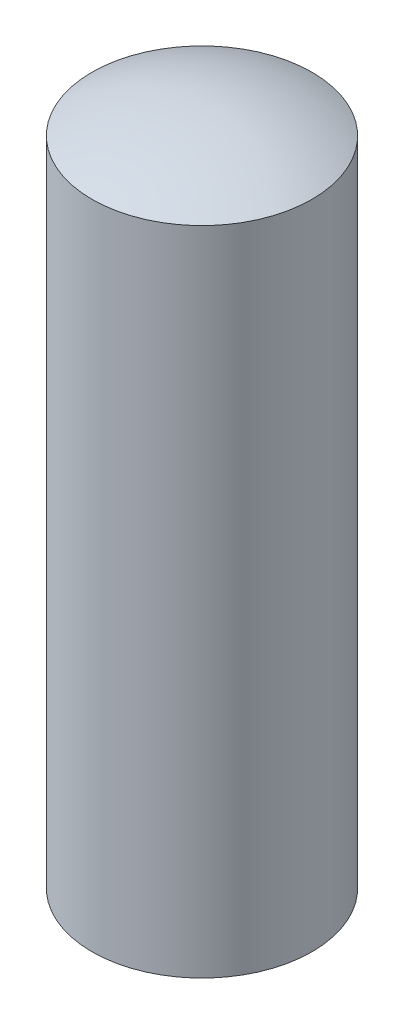
ISO-10303-21;
HEADER;
FILE_DESCRIPTION(('STEP AP214'),'2;1');
FILE_NAME('part.step','',(''),(''),'','','');
FILE_SCHEMA(('AUTOMOTIVE_DESIGN { 1 0 10303 214 1 1 1 1 }'));
ENDSEC;
DATA;
#1=APPLICATION_CONTEXT('core data for automotive mechanical design processes');
#2=APPLICATION_PROTOCOL_DEFINITION('international standard','automotive_design',2000,#1);
#3=PRODUCT_CONTEXT('',#1,'mechanical');
#4=PRODUCT('Part','Part','',(#3));
#5=PRODUCT_RELATED_PRODUCT_CATEGORY('part','',(#4));
#6=PRODUCT_DEFINITION_FORMATION('','',#4);
#7=PRODUCT_DEFINITION_CONTEXT('part definition',#1,'design');
#8=PRODUCT_DEFINITION('design','',#6,#7);
#9=PRODUCT_DEFINITION_SHAPE('','',#8);
#10=(LENGTH_UNIT() NAMED_UNIT(*) SI_UNIT(.MILLI.,.METRE.));
#11=(NAMED_UNIT(*) PLANE_ANGLE_UNIT() SI_UNIT($,.RADIAN.));
#12=(NAMED_UNIT(*) SI_UNIT($,.STERADIAN.) SOLID_ANGLE_UNIT());
#13=UNCERTAINTY_MEASURE_WITH_UNIT(LENGTH_MEASURE(1.E-05),#10,'distance_accuracy_value','');
#14=(GEOMETRIC_REPRESENTATION_CONTEXT(3) GLOBAL_UNCERTAINTY_ASSIGNED_CONTEXT((#13)) GLOBAL_UNIT_ASSIGNED_CONTEXT((#10,
#11,#12)) REPRESENTATION_CONTEXT('',''));
#15=CARTESIAN_POINT('',(0.,0.,0.));
#16=DIRECTION('',(0.,0.,1.));
#17=DIRECTION('',(1.,0.,0.));
#18=AXIS2_PLACEMENT_3D('',#15,#16,#17);
#19=CARTESIAN_POINT('',(0.,-11.0166666666667,0.));
#20=DIRECTION('',(0.,1.,0.));
#21=DIRECTION('',(1.,0.,0.));
#22=AXIS2_PLACEMENT_3D('',#19,#20,#21);
#23=SPHERICAL_SURFACE('',#22,11.0166666666667);
#24=CARTESIAN_POINT('',(0.,-1.2,0.));
#25=DIRECTION('',(0.,1.,0.));
#26=DIRECTION('',(-1.,0.,0.));
#27=AXIS2_PLACEMENT_3D('',#24,#25,#26);
#28=CIRCLE('',#27,5.);
#29=CARTESIAN_POINT('',(-5.,-1.2,0.));
#30=VERTEX_POINT('',#29);
#31=EDGE_CURVE('E10',#30,#30,#28,.T.);
#32=ORIENTED_EDGE('',*,*,#31,.T.);
#33=EDGE_LOOP('',(#32));
#34=FACE_BOUND('',#33,.T.);
#35=ADVANCED_FACE('F37',(#34),#23,.T.);
#36=CARTESIAN_POINT('',(0.,5.,0.));
#37=DIRECTION('',(0.,1.,0.));
#38=DIRECTION('',(-1.,0.,0.));
#39=AXIS2_PLACEMENT_3D('',#36,#37,#38);
#40=CYLINDRICAL_SURFACE('',#39,5.);
#41=ORIENTED_EDGE('',*,*,#31,.F.);
#42=EDGE_LOOP('',(#41));
#43=FACE_BOUND('',#42,.T.);
#44=CARTESIAN_POINT('',(0.,-30.8,0.));
#45=DIRECTION('',(0.,1.,0.));
#46=DIRECTION('',(-1.,0.,0.));
#47=AXIS2_PLACEMENT_3D('',#44,#45,#46);
#48=CIRCLE('',#47,5.);
#49=CARTESIAN_POINT('',(-4.99999999999999,-30.8,0.));
#50=VERTEX_POINT('',#49);
#51=EDGE_CURVE('E43',#50,#50,#48,.T.);
#52=ORIENTED_EDGE('',*,*,#51,.T.);
#53=EDGE_LOOP('',(#52));
#54=FACE_BOUND('',#53,.T.);
#55=ADVANCED_FACE('F49',(#43,#54),#40,.T.);
#56=CARTESIAN_POINT('',(0.,-20.9833333333334,0.));
#57=DIRECTION('',(0.,1.,0.));
#58=DIRECTION('',(1.,0.,0.));
#59=AXIS2_PLACEMENT_3D('',#56,#57,#58);
#60=SPHERICAL_SURFACE('',#59,11.0166666666666);
#61=ORIENTED_EDGE('',*,*,#51,.F.);
#62=EDGE_LOOP('',(#61));
#63=FACE_BOUND('',#62,.T.);
#64=ADVANCED_FACE('F51',(#63),#60,.T.);
#65=CLOSED_SHELL('',(#35,#55,#64));
#66=MANIFOLD_SOLID_BREP('B2',#65);
#67=ADVANCED_BREP_SHAPE_REPRESENTATION('',(#18,#66),#14);
#68=SHAPE_DEFINITION_REPRESENTATION(#9,#67);
ENDSEC;
END-ISO-10303-21;
